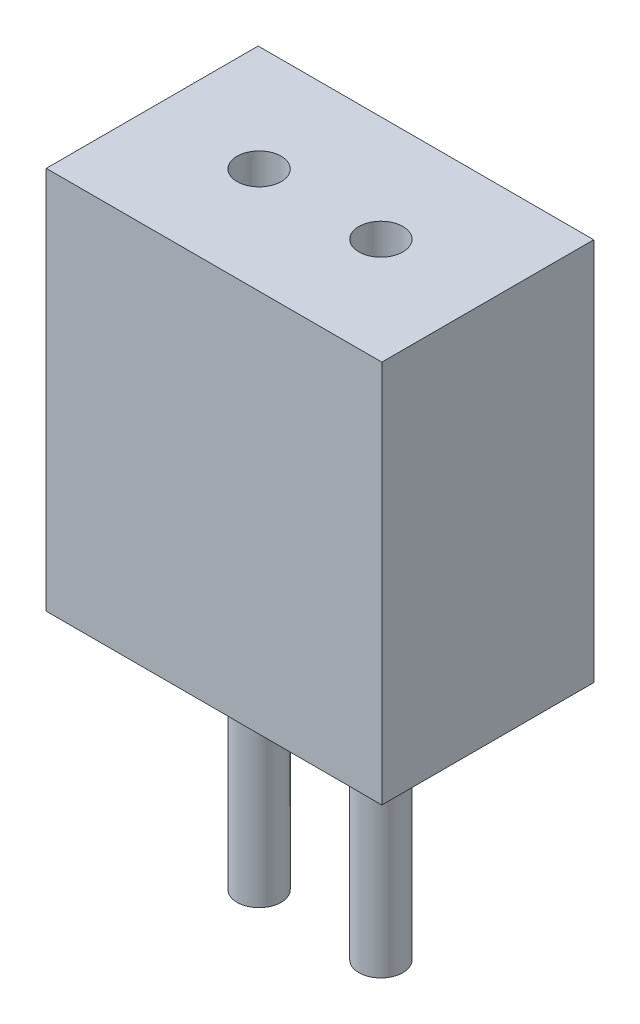
ISO-10303-21;
HEADER;
FILE_DESCRIPTION(('STEP AP214'),'2;1');
FILE_NAME('part.step','',(''),(''),'','','');
FILE_SCHEMA(('AUTOMOTIVE_DESIGN { 1 0 10303 214 1 1 1 1 }'));
ENDSEC;
DATA;
#1=APPLICATION_CONTEXT('core data for automotive mechanical design processes');
#2=APPLICATION_PROTOCOL_DEFINITION('international standard','automotive_design',2000,#1);
#3=PRODUCT_CONTEXT('',#1,'mechanical');
#4=PRODUCT('Part','Part','',(#3));
#5=PRODUCT_RELATED_PRODUCT_CATEGORY('part','',(#4));
#6=PRODUCT_DEFINITION_FORMATION('','',#4);
#7=PRODUCT_DEFINITION_CONTEXT('part definition',#1,'design');
#8=PRODUCT_DEFINITION('design','',#6,#7);
#9=PRODUCT_DEFINITION_SHAPE('','',#8);
#10=(LENGTH_UNIT() NAMED_UNIT(*) SI_UNIT(.MILLI.,.METRE.));
#11=(NAMED_UNIT(*) PLANE_ANGLE_UNIT() SI_UNIT($,.RADIAN.));
#12=(NAMED_UNIT(*) SI_UNIT($,.STERADIAN.) SOLID_ANGLE_UNIT());
#13=UNCERTAINTY_MEASURE_WITH_UNIT(LENGTH_MEASURE(1.E-05),#10,'distance_accuracy_value','');
#14=(GEOMETRIC_REPRESENTATION_CONTEXT(3) GLOBAL_UNCERTAINTY_ASSIGNED_CONTEXT((#13)) GLOBAL_UNIT_ASSIGNED_CONTEXT((#10,
#11,#12)) REPRESENTATION_CONTEXT('',''));
#15=CARTESIAN_POINT('',(0.,0.,0.));
#16=DIRECTION('',(0.,0.,1.));
#17=DIRECTION('',(1.,0.,0.));
#18=AXIS2_PLACEMENT_3D('',#15,#16,#17);
#19=CARTESIAN_POINT('',(0.,4.,0.));
#20=DIRECTION('',(1.,0.,0.));
#21=DIRECTION('',(0.,0.,-1.));
#22=AXIS2_PLACEMENT_3D('',#19,#20,#21);
#23=PLANE('',#22);
#24=DIRECTION('',(0.,0.,1.));
#25=VECTOR('',#24,1.);
#26=CARTESIAN_POINT('',(0.,0.,0.));
#27=LINE('',#26,#25);
#28=CARTESIAN_POINT('',(0.,0.,-2.21));
#29=VERTEX_POINT('',#28);
#30=CARTESIAN_POINT('',(0.,0.,0.));
#31=VERTEX_POINT('',#30);
#32=EDGE_CURVE('E96',#29,#31,#27,.T.);
#33=ORIENTED_EDGE('',*,*,#32,.T.);
#34=DIRECTION('',(0.,-1.,0.));
#35=VECTOR('',#34,1.);
#36=CARTESIAN_POINT('',(0.,4.,0.));
#37=LINE('',#36,#35);
#38=CARTESIAN_POINT('',(0.,4.,0.));
#39=VERTEX_POINT('',#38);
#40=EDGE_CURVE('E11',#39,#31,#37,.T.);
#41=ORIENTED_EDGE('',*,*,#40,.F.);
#42=DIRECTION('',(0.,0.,1.));
#43=VECTOR('',#42,1.);
#44=CARTESIAN_POINT('',(0.,4.,0.));
#45=LINE('',#44,#43);
#46=CARTESIAN_POINT('',(0.,4.,-2.21));
#47=VERTEX_POINT('',#46);
#48=EDGE_CURVE('E84',#47,#39,#45,.T.);
#49=ORIENTED_EDGE('',*,*,#48,.F.);
#50=DIRECTION('',(0.,-1.,0.));
#51=VECTOR('',#50,1.);
#52=CARTESIAN_POINT('',(0.,4.,-2.21));
#53=LINE('',#52,#51);
#54=EDGE_CURVE('E92',#47,#29,#53,.T.);
#55=ORIENTED_EDGE('',*,*,#54,.T.);
#56=EDGE_LOOP('',(#33,#41,#49,#55));
#57=FACE_BOUND('',#56,.T.);
#58=ADVANCED_FACE('F33',(#57),#23,.F.);
#59=CARTESIAN_POINT('',(0.,4.,0.));
#60=DIRECTION('',(0.,0.,-1.));
#61=DIRECTION('',(-1.,0.,0.));
#62=AXIS2_PLACEMENT_3D('',#59,#60,#61);
#63=PLANE('',#62);
#64=DIRECTION('',(1.,0.,0.));
#65=VECTOR('',#64,1.);
#66=CARTESIAN_POINT('',(0.,0.,0.));
#67=LINE('',#66,#65);
#68=CARTESIAN_POINT('',(3.5,0.,0.));
#69=VERTEX_POINT('',#68);
#70=EDGE_CURVE('E88',#31,#69,#67,.T.);
#71=ORIENTED_EDGE('',*,*,#70,.T.);
#72=DIRECTION('',(0.,-1.,0.));
#73=VECTOR('',#72,1.);
#74=CARTESIAN_POINT('',(3.5,4.,0.));
#75=LINE('',#74,#73);
#76=CARTESIAN_POINT('',(3.5,4.,0.));
#77=VERTEX_POINT('',#76);
#78=EDGE_CURVE('E41',#77,#69,#75,.T.);
#79=ORIENTED_EDGE('',*,*,#78,.F.);
#80=DIRECTION('',(1.,0.,0.));
#81=VECTOR('',#80,1.);
#82=CARTESIAN_POINT('',(0.,4.,0.));
#83=LINE('',#82,#81);
#84=EDGE_CURVE('E79',#39,#77,#83,.T.);
#85=ORIENTED_EDGE('',*,*,#84,.F.);
#86=ORIENTED_EDGE('',*,*,#40,.T.);
#87=EDGE_LOOP('',(#71,#79,#85,#86));
#88=FACE_BOUND('',#87,.T.);
#89=ADVANCED_FACE('F87',(#88),#63,.F.);
#90=CARTESIAN_POINT('',(3.5,4.,0.));
#91=DIRECTION('',(-1.,0.,0.));
#92=DIRECTION('',(0.,0.,1.));
#93=AXIS2_PLACEMENT_3D('',#90,#91,#92);
#94=PLANE('',#93);
#95=DIRECTION('',(0.,0.,-1.));
#96=VECTOR('',#95,1.);
#97=CARTESIAN_POINT('',(3.5,0.,0.));
#98=LINE('',#97,#96);
#99=CARTESIAN_POINT('',(3.5,0.,-2.21));
#100=VERTEX_POINT('',#99);
#101=EDGE_CURVE('E66',#69,#100,#98,.T.);
#102=ORIENTED_EDGE('',*,*,#101,.T.);
#103=DIRECTION('',(0.,-1.,0.));
#104=VECTOR('',#103,1.);
#105=CARTESIAN_POINT('',(3.5,4.,-2.21));
#106=LINE('',#105,#104);
#107=CARTESIAN_POINT('',(3.5,4.,-2.21));
#108=VERTEX_POINT('',#107);
#109=EDGE_CURVE('E89',#108,#100,#106,.T.);
#110=ORIENTED_EDGE('',*,*,#109,.F.);
#111=DIRECTION('',(0.,0.,-1.));
#112=VECTOR('',#111,1.);
#113=CARTESIAN_POINT('',(3.5,4.,0.));
#114=LINE('',#113,#112);
#115=EDGE_CURVE('E82',#77,#108,#114,.T.);
#116=ORIENTED_EDGE('',*,*,#115,.F.);
#117=ORIENTED_EDGE('',*,*,#78,.T.);
#118=EDGE_LOOP('',(#102,#110,#116,#117));
#119=FACE_BOUND('',#118,.T.);
#120=ADVANCED_FACE('F90',(#119),#94,.F.);
#121=CARTESIAN_POINT('',(0.,4.,-2.21));
#122=DIRECTION('',(0.,0.,1.));
#123=DIRECTION('',(1.,0.,0.));
#124=AXIS2_PLACEMENT_3D('',#121,#122,#123);
#125=PLANE('',#124);
#126=DIRECTION('',(-1.,0.,0.));
#127=VECTOR('',#126,1.);
#128=CARTESIAN_POINT('',(0.,0.,-2.21));
#129=LINE('',#128,#127);
#130=EDGE_CURVE('E72',#100,#29,#129,.T.);
#131=ORIENTED_EDGE('',*,*,#130,.T.);
#132=ORIENTED_EDGE('',*,*,#54,.F.);
#133=DIRECTION('',(-1.,0.,0.));
#134=VECTOR('',#133,1.);
#135=CARTESIAN_POINT('',(0.,4.,-2.21));
#136=LINE('',#135,#134);
#137=EDGE_CURVE('E49',#108,#47,#136,.T.);
#138=ORIENTED_EDGE('',*,*,#137,.F.);
#139=ORIENTED_EDGE('',*,*,#109,.T.);
#140=EDGE_LOOP('',(#131,#132,#138,#139));
#141=FACE_BOUND('',#140,.T.);
#142=ADVANCED_FACE('F104',(#141),#125,.F.);
#143=CARTESIAN_POINT('',(0.,4.,0.));
#144=DIRECTION('',(0.,-1.,0.));
#145=DIRECTION('',(0.,0.,-1.));
#146=AXIS2_PLACEMENT_3D('',#143,#144,#145);
#147=PLANE('',#146);
#148=CARTESIAN_POINT('',(2.385,4.,-1.105));
#149=DIRECTION('',(0.,1.,0.));
#150=DIRECTION('',(0.,0.,1.));
#151=AXIS2_PLACEMENT_3D('',#148,#149,#150);
#152=CIRCLE('',#151,0.23);
#153=CARTESIAN_POINT('',(2.385,4.,-0.875));
#154=VERTEX_POINT('',#153);
#155=EDGE_CURVE('E128',#154,#154,#152,.T.);
#156=ORIENTED_EDGE('',*,*,#155,.F.);
#157=EDGE_LOOP('',(#156));
#158=FACE_BOUND('',#157,.T.);
#159=CARTESIAN_POINT('',(1.115,4.,-1.105));
#160=DIRECTION('',(0.,1.,0.));
#161=DIRECTION('',(0.,0.,1.));
#162=AXIS2_PLACEMENT_3D('',#159,#160,#161);
#163=CIRCLE('',#162,0.23);
#164=CARTESIAN_POINT('',(1.115,4.,-0.875));
#165=VERTEX_POINT('',#164);
#166=EDGE_CURVE('E122',#165,#165,#163,.T.);
#167=ORIENTED_EDGE('',*,*,#166,.F.);
#168=EDGE_LOOP('',(#167));
#169=FACE_BOUND('',#168,.T.);
#170=ORIENTED_EDGE('',*,*,#48,.T.);
#171=ORIENTED_EDGE('',*,*,#84,.T.);
#172=ORIENTED_EDGE('',*,*,#115,.T.);
#173=ORIENTED_EDGE('',*,*,#137,.T.);
#174=EDGE_LOOP('',(#170,#171,#172,#173));
#175=FACE_BOUND('',#174,.T.);
#176=ADVANCED_FACE('F80',(#158,#169,#175),#147,.F.);
#177=CARTESIAN_POINT('',(0.,0.,0.));
#178=DIRECTION('',(0.,-1.,0.));
#179=DIRECTION('',(0.,0.,-1.));
#180=AXIS2_PLACEMENT_3D('',#177,#178,#179);
#181=PLANE('',#180);
#182=CARTESIAN_POINT('',(2.385,0.,-1.105));
#183=DIRECTION('',(0.,-1.,0.));
#184=DIRECTION('',(0.,0.,-1.));
#185=AXIS2_PLACEMENT_3D('',#182,#183,#184);
#186=CIRCLE('',#185,0.23);
#187=CARTESIAN_POINT('',(2.385,0.,-1.335));
#188=VERTEX_POINT('',#187);
#189=EDGE_CURVE('E116',#188,#188,#186,.T.);
#190=ORIENTED_EDGE('',*,*,#189,.F.);
#191=EDGE_LOOP('',(#190));
#192=FACE_BOUND('',#191,.T.);
#193=CARTESIAN_POINT('',(1.115,0.,-1.105));
#194=DIRECTION('',(0.,-1.,0.));
#195=DIRECTION('',(0.,0.,-1.));
#196=AXIS2_PLACEMENT_3D('',#193,#194,#195);
#197=CIRCLE('',#196,0.23);
#198=CARTESIAN_POINT('',(1.115,0.,-1.335));
#199=VERTEX_POINT('',#198);
#200=EDGE_CURVE('E110',#199,#199,#197,.T.);
#201=ORIENTED_EDGE('',*,*,#200,.F.);
#202=EDGE_LOOP('',(#201));
#203=FACE_BOUND('',#202,.T.);
#204=ORIENTED_EDGE('',*,*,#32,.F.);
#205=ORIENTED_EDGE('',*,*,#130,.F.);
#206=ORIENTED_EDGE('',*,*,#101,.F.);
#207=ORIENTED_EDGE('',*,*,#70,.F.);
#208=EDGE_LOOP('',(#204,#205,#206,#207));
#209=FACE_BOUND('',#208,.T.);
#210=ADVANCED_FACE('F107',(#192,#203,#209),#181,.T.);
#211=CARTESIAN_POINT('',(1.115,-2.51,-1.105));
#212=DIRECTION('',(0.,1.,0.));
#213=DIRECTION('',(0.,0.,1.));
#214=AXIS2_PLACEMENT_3D('',#211,#212,#213);
#215=CYLINDRICAL_SURFACE('',#214,0.23);
#216=CARTESIAN_POINT('',(1.115,-2.51,-1.105));
#217=DIRECTION('',(0.,-1.,0.));
#218=DIRECTION('',(0.,0.,-1.));
#219=AXIS2_PLACEMENT_3D('',#216,#217,#218);
#220=CIRCLE('',#219,0.23);
#221=CARTESIAN_POINT('',(1.115,-2.51,-1.335));
#222=VERTEX_POINT('',#221);
#223=EDGE_CURVE('E99',#222,#222,#220,.T.);
#224=ORIENTED_EDGE('',*,*,#223,.F.);
#225=EDGE_LOOP('',(#224));
#226=FACE_BOUND('',#225,.T.);
#227=ORIENTED_EDGE('',*,*,#200,.T.);
#228=EDGE_LOOP('',(#227));
#229=FACE_BOUND('',#228,.T.);
#230=ADVANCED_FACE('F175',(#226,#229),#215,.T.);
#231=CARTESIAN_POINT('',(1.115,-2.51,-1.105));
#232=DIRECTION('',(0.,-1.,0.));
#233=DIRECTION('',(0.,0.,-1.));
#234=AXIS2_PLACEMENT_3D('',#231,#232,#233);
#235=PLANE('',#234);
#236=ORIENTED_EDGE('',*,*,#223,.T.);
#237=EDGE_LOOP('',(#236));
#238=FACE_BOUND('',#237,.T.);
#239=ADVANCED_FACE('F180',(#238),#235,.T.);
#240=CARTESIAN_POINT('',(2.385,-2.51,-1.105));
#241=DIRECTION('',(0.,1.,0.));
#242=DIRECTION('',(0.,0.,1.));
#243=AXIS2_PLACEMENT_3D('',#240,#241,#242);
#244=CYLINDRICAL_SURFACE('',#243,0.23);
#245=CARTESIAN_POINT('',(2.385,-2.51,-1.105));
#246=DIRECTION('',(0.,-1.,0.));
#247=DIRECTION('',(0.,0.,-1.));
#248=AXIS2_PLACEMENT_3D('',#245,#246,#247);
#249=CIRCLE('',#248,0.23);
#250=CARTESIAN_POINT('',(2.385,-2.51,-1.335));
#251=VERTEX_POINT('',#250);
#252=EDGE_CURVE('E113',#251,#251,#249,.T.);
#253=ORIENTED_EDGE('',*,*,#252,.F.);
#254=EDGE_LOOP('',(#253));
#255=FACE_BOUND('',#254,.T.);
#256=ORIENTED_EDGE('',*,*,#189,.T.);
#257=EDGE_LOOP('',(#256));
#258=FACE_BOUND('',#257,.T.);
#259=ADVANCED_FACE('F159',(#255,#258),#244,.T.);
#260=CARTESIAN_POINT('',(2.385,-2.51,-1.105));
#261=DIRECTION('',(0.,-1.,0.));
#262=DIRECTION('',(0.,0.,-1.));
#263=AXIS2_PLACEMENT_3D('',#260,#261,#262);
#264=PLANE('',#263);
#265=ORIENTED_EDGE('',*,*,#252,.T.);
#266=EDGE_LOOP('',(#265));
#267=FACE_BOUND('',#266,.T.);
#268=ADVANCED_FACE('F150',(#267),#264,.T.);
#269=CARTESIAN_POINT('',(1.115,1.49,-1.105));
#270=DIRECTION('',(0.,1.,0.));
#271=DIRECTION('',(0.,0.,1.));
#272=AXIS2_PLACEMENT_3D('',#269,#270,#271);
#273=CYLINDRICAL_SURFACE('',#272,0.23);
#274=CARTESIAN_POINT('',(1.115,1.49,-1.105));
#275=DIRECTION('',(0.,1.,0.));
#276=DIRECTION('',(0.,0.,1.));
#277=AXIS2_PLACEMENT_3D('',#274,#275,#276);
#278=CIRCLE('',#277,0.23);
#279=CARTESIAN_POINT('',(1.115,1.49,-0.875));
#280=VERTEX_POINT('',#279);
#281=EDGE_CURVE('E125',#280,#280,#278,.T.);
#282=ORIENTED_EDGE('',*,*,#281,.F.);
#283=EDGE_LOOP('',(#282));
#284=FACE_BOUND('',#283,.T.);
#285=ORIENTED_EDGE('',*,*,#166,.T.);
#286=EDGE_LOOP('',(#285));
#287=FACE_BOUND('',#286,.T.);
#288=ADVANCED_FACE('F148',(#284,#287),#273,.F.);
#289=CARTESIAN_POINT('',(1.115,1.49,-1.105));
#290=DIRECTION('',(0.,1.,0.));
#291=DIRECTION('',(0.,0.,1.));
#292=AXIS2_PLACEMENT_3D('',#289,#290,#291);
#293=PLANE('',#292);
#294=ORIENTED_EDGE('',*,*,#281,.T.);
#295=EDGE_LOOP('',(#294));
#296=FACE_BOUND('',#295,.T.);
#297=ADVANCED_FACE('F139',(#296),#293,.T.);
#298=CARTESIAN_POINT('',(2.385,1.49,-1.105));
#299=DIRECTION('',(0.,1.,0.));
#300=DIRECTION('',(0.,0.,1.));
#301=AXIS2_PLACEMENT_3D('',#298,#299,#300);
#302=CYLINDRICAL_SURFACE('',#301,0.23);
#303=CARTESIAN_POINT('',(2.385,1.49,-1.105));
#304=DIRECTION('',(0.,1.,0.));
#305=DIRECTION('',(0.,0.,1.));
#306=AXIS2_PLACEMENT_3D('',#303,#304,#305);
#307=CIRCLE('',#306,0.23);
#308=CARTESIAN_POINT('',(2.385,1.49,-0.875));
#309=VERTEX_POINT('',#308);
#310=EDGE_CURVE('E119',#309,#309,#307,.T.);
#311=ORIENTED_EDGE('',*,*,#310,.F.);
#312=EDGE_LOOP('',(#311));
#313=FACE_BOUND('',#312,.T.);
#314=ORIENTED_EDGE('',*,*,#155,.T.);
#315=EDGE_LOOP('',(#314));
#316=FACE_BOUND('',#315,.T.);
#317=ADVANCED_FACE('F136',(#313,#316),#302,.F.);
#318=CARTESIAN_POINT('',(2.385,1.49,-1.105));
#319=DIRECTION('',(0.,1.,0.));
#320=DIRECTION('',(0.,0.,1.));
#321=AXIS2_PLACEMENT_3D('',#318,#319,#320);
#322=PLANE('',#321);
#323=ORIENTED_EDGE('',*,*,#310,.T.);
#324=EDGE_LOOP('',(#323));
#325=FACE_BOUND('',#324,.T.);
#326=ADVANCED_FACE('F134',(#325),#322,.T.);
#327=CLOSED_SHELL('',(#58,#89,#120,#142,#176,#210,#230,#239,#259,#268,#288,#297,#317,#326));
#328=MANIFOLD_SOLID_BREP('B2',#327);
#329=ADVANCED_BREP_SHAPE_REPRESENTATION('',(#18,#328),#14);
#330=SHAPE_DEFINITION_REPRESENTATION(#9,#329);
ENDSEC;
END-ISO-10303-21;
